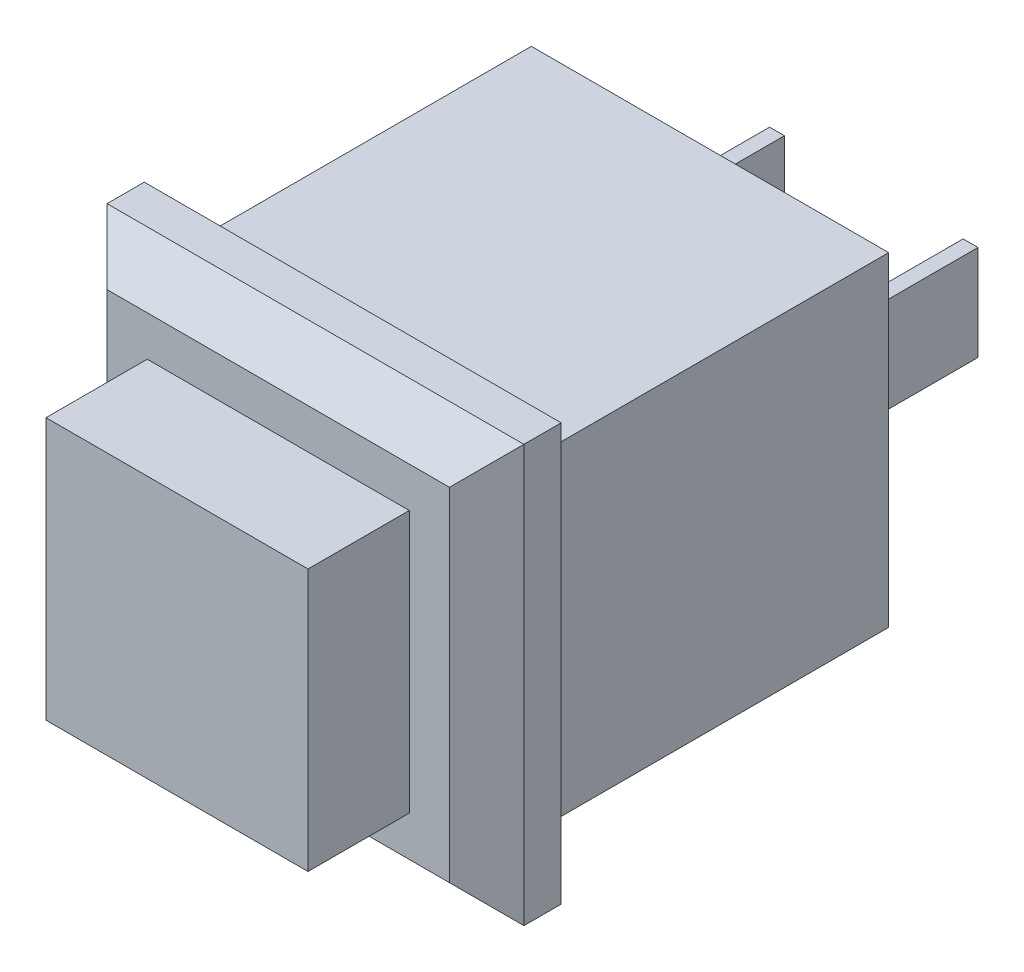
ISO-10303-21;
HEADER;
FILE_DESCRIPTION(('STEP AP214'),'2;1');
FILE_NAME('part.step','',(''),(''),'','','');
FILE_SCHEMA(('AUTOMOTIVE_DESIGN { 1 0 10303 214 1 1 1 1 }'));
ENDSEC;
DATA;
#1=APPLICATION_CONTEXT('core data for automotive mechanical design processes');
#2=APPLICATION_PROTOCOL_DEFINITION('international standard','automotive_design',2000,#1);
#3=PRODUCT_CONTEXT('',#1,'mechanical');
#4=PRODUCT('Part','Part','',(#3));
#5=PRODUCT_RELATED_PRODUCT_CATEGORY('part','',(#4));
#6=PRODUCT_DEFINITION_FORMATION('','',#4);
#7=PRODUCT_DEFINITION_CONTEXT('part definition',#1,'design');
#8=PRODUCT_DEFINITION('design','',#6,#7);
#9=PRODUCT_DEFINITION_SHAPE('','',#8);
#10=(LENGTH_UNIT() NAMED_UNIT(*) SI_UNIT(.MILLI.,.METRE.));
#11=(NAMED_UNIT(*) PLANE_ANGLE_UNIT() SI_UNIT($,.RADIAN.));
#12=(NAMED_UNIT(*) SI_UNIT($,.STERADIAN.) SOLID_ANGLE_UNIT());
#13=UNCERTAINTY_MEASURE_WITH_UNIT(LENGTH_MEASURE(1.E-05),#10,'distance_accuracy_value','');
#14=(GEOMETRIC_REPRESENTATION_CONTEXT(3) GLOBAL_UNCERTAINTY_ASSIGNED_CONTEXT((#13)) GLOBAL_UNIT_ASSIGNED_CONTEXT((#10,
#11,#12)) REPRESENTATION_CONTEXT('',''));
#15=CARTESIAN_POINT('',(0.,0.,0.));
#16=DIRECTION('',(0.,0.,1.));
#17=DIRECTION('',(1.,0.,0.));
#18=AXIS2_PLACEMENT_3D('',#15,#16,#17);
#19=CARTESIAN_POINT('',(-6.,5.45,17.5));
#20=DIRECTION('',(-1.,0.,0.));
#21=DIRECTION('',(0.,-1.,0.));
#22=AXIS2_PLACEMENT_3D('',#19,#20,#21);
#23=PLANE('',#22);
#24=DIRECTION('',(0.,0.,-1.));
#25=VECTOR('',#24,1.);
#26=CARTESIAN_POINT('',(-6.,5.45,17.5));
#27=LINE('',#26,#25);
#28=CARTESIAN_POINT('',(-6.,5.45,17.5));
#29=VERTEX_POINT('',#28);
#30=CARTESIAN_POINT('',(-6.,5.45,5.5));
#31=VERTEX_POINT('',#30);
#32=EDGE_CURVE('E282',#29,#31,#27,.T.);
#33=ORIENTED_EDGE('',*,*,#32,.T.);
#34=DIRECTION('',(0.,1.,0.));
#35=VECTOR('',#34,1.);
#36=CARTESIAN_POINT('',(-6.,5.45,5.5));
#37=LINE('',#36,#35);
#38=CARTESIAN_POINT('',(-6.,-5.45,5.5));
#39=VERTEX_POINT('',#38);
#40=EDGE_CURVE('E266',#39,#31,#37,.T.);
#41=ORIENTED_EDGE('',*,*,#40,.F.);
#42=DIRECTION('',(0.,0.,-1.));
#43=VECTOR('',#42,1.);
#44=CARTESIAN_POINT('',(-6.,-5.45,17.5));
#45=LINE('',#44,#43);
#46=CARTESIAN_POINT('',(-6.,-5.45,17.5));
#47=VERTEX_POINT('',#46);
#48=EDGE_CURVE('E283',#47,#39,#45,.T.);
#49=ORIENTED_EDGE('',*,*,#48,.F.);
#50=DIRECTION('',(0.,1.,0.));
#51=VECTOR('',#50,1.);
#52=CARTESIAN_POINT('',(-6.,5.45,17.5));
#53=LINE('',#52,#51);
#54=EDGE_CURVE('E270',#47,#29,#53,.T.);
#55=ORIENTED_EDGE('',*,*,#54,.T.);
#56=EDGE_LOOP('',(#33,#41,#49,#55));
#57=FACE_BOUND('',#56,.T.);
#58=ADVANCED_FACE('F35',(#57),#23,.T.);
#59=CARTESIAN_POINT('',(6.,-5.45,17.5));
#60=DIRECTION('',(0.,-1.,0.));
#61=DIRECTION('',(0.,0.,-1.));
#62=AXIS2_PLACEMENT_3D('',#59,#60,#61);
#63=PLANE('',#62);
#64=ORIENTED_EDGE('',*,*,#48,.T.);
#65=DIRECTION('',(-1.,0.,0.));
#66=VECTOR('',#65,1.);
#67=CARTESIAN_POINT('',(6.,-5.45,5.5));
#68=LINE('',#67,#66);
#69=CARTESIAN_POINT('',(6.,-5.45,5.5));
#70=VERTEX_POINT('',#69);
#71=EDGE_CURVE('E264',#70,#39,#68,.T.);
#72=ORIENTED_EDGE('',*,*,#71,.F.);
#73=DIRECTION('',(0.,0.,-1.));
#74=VECTOR('',#73,1.);
#75=CARTESIAN_POINT('',(6.,-5.45,17.5));
#76=LINE('',#75,#74);
#77=CARTESIAN_POINT('',(6.,-5.45,17.5));
#78=VERTEX_POINT('',#77);
#79=EDGE_CURVE('E287',#78,#70,#76,.T.);
#80=ORIENTED_EDGE('',*,*,#79,.F.);
#81=DIRECTION('',(-1.,0.,0.));
#82=VECTOR('',#81,1.);
#83=CARTESIAN_POINT('',(6.,-5.45,17.5));
#84=LINE('',#83,#82);
#85=EDGE_CURVE('E279',#78,#47,#84,.T.);
#86=ORIENTED_EDGE('',*,*,#85,.T.);
#87=EDGE_LOOP('',(#64,#72,#80,#86));
#88=FACE_BOUND('',#87,.T.);
#89=ADVANCED_FACE('F427',(#88),#63,.T.);
#90=CARTESIAN_POINT('',(6.,5.45,17.5));
#91=DIRECTION('',(1.,0.,0.));
#92=DIRECTION('',(0.,1.,0.));
#93=AXIS2_PLACEMENT_3D('',#90,#91,#92);
#94=PLANE('',#93);
#95=ORIENTED_EDGE('',*,*,#79,.T.);
#96=DIRECTION('',(0.,-1.,0.));
#97=VECTOR('',#96,1.);
#98=CARTESIAN_POINT('',(6.,5.45,5.5));
#99=LINE('',#98,#97);
#100=CARTESIAN_POINT('',(6.,5.45,5.5));
#101=VERTEX_POINT('',#100);
#102=EDGE_CURVE('E256',#101,#70,#99,.T.);
#103=ORIENTED_EDGE('',*,*,#102,.F.);
#104=DIRECTION('',(0.,0.,-1.));
#105=VECTOR('',#104,1.);
#106=CARTESIAN_POINT('',(6.,5.45,17.5));
#107=LINE('',#106,#105);
#108=CARTESIAN_POINT('',(6.,5.45,17.5));
#109=VERTEX_POINT('',#108);
#110=EDGE_CURVE('E290',#109,#101,#107,.T.);
#111=ORIENTED_EDGE('',*,*,#110,.F.);
#112=DIRECTION('',(0.,-1.,0.));
#113=VECTOR('',#112,1.);
#114=CARTESIAN_POINT('',(6.,5.45,17.5));
#115=LINE('',#114,#113);
#116=EDGE_CURVE('E276',#109,#78,#115,.T.);
#117=ORIENTED_EDGE('',*,*,#116,.T.);
#118=EDGE_LOOP('',(#95,#103,#111,#117));
#119=FACE_BOUND('',#118,.T.);
#120=ADVANCED_FACE('F434',(#119),#94,.T.);
#121=CARTESIAN_POINT('',(6.,5.45,17.5));
#122=DIRECTION('',(0.,1.,0.));
#123=DIRECTION('',(0.,0.,1.));
#124=AXIS2_PLACEMENT_3D('',#121,#122,#123);
#125=PLANE('',#124);
#126=ORIENTED_EDGE('',*,*,#110,.T.);
#127=DIRECTION('',(1.,0.,0.));
#128=VECTOR('',#127,1.);
#129=CARTESIAN_POINT('',(6.,5.45,5.5));
#130=LINE('',#129,#128);
#131=EDGE_CURVE('E268',#31,#101,#130,.T.);
#132=ORIENTED_EDGE('',*,*,#131,.F.);
#133=ORIENTED_EDGE('',*,*,#32,.F.);
#134=DIRECTION('',(1.,0.,0.));
#135=VECTOR('',#134,1.);
#136=CARTESIAN_POINT('',(6.,5.45,17.5));
#137=LINE('',#136,#135);
#138=EDGE_CURVE('E273',#29,#109,#137,.T.);
#139=ORIENTED_EDGE('',*,*,#138,.T.);
#140=EDGE_LOOP('',(#126,#132,#133,#139));
#141=FACE_BOUND('',#140,.T.);
#142=ADVANCED_FACE('F438',(#141),#125,.T.);
#143=CARTESIAN_POINT('',(7.,7.,23.4));
#144=DIRECTION('',(-1.,0.,0.));
#145=DIRECTION('',(0.,-1.,0.));
#146=AXIS2_PLACEMENT_3D('',#143,#144,#145);
#147=PLANE('',#146);
#148=DIRECTION('',(0.,0.,-1.));
#149=VECTOR('',#148,1.);
#150=CARTESIAN_POINT('',(7.,7.,23.4));
#151=LINE('',#150,#149);
#152=CARTESIAN_POINT('',(7.,7.,18.75));
#153=VERTEX_POINT('',#152);
#154=CARTESIAN_POINT('',(7.,7.,17.5));
#155=VERTEX_POINT('',#154);
#156=EDGE_CURVE('E345',#153,#155,#151,.T.);
#157=ORIENTED_EDGE('',*,*,#156,.F.);
#158=DIRECTION('',(0.,-1.,0.));
#159=VECTOR('',#158,1.);
#160=CARTESIAN_POINT('',(7.,-7.,18.75));
#161=LINE('',#160,#159);
#162=CARTESIAN_POINT('',(7.,-7.,18.75));
#163=VERTEX_POINT('',#162);
#164=EDGE_CURVE('E44',#153,#163,#161,.T.);
#165=ORIENTED_EDGE('',*,*,#164,.T.);
#166=DIRECTION('',(0.,0.,-1.));
#167=VECTOR('',#166,1.);
#168=CARTESIAN_POINT('',(7.,-7.,23.4));
#169=LINE('',#168,#167);
#170=CARTESIAN_POINT('',(7.,-7.,17.5));
#171=VERTEX_POINT('',#170);
#172=EDGE_CURVE('E333',#163,#171,#169,.T.);
#173=ORIENTED_EDGE('',*,*,#172,.T.);
#174=DIRECTION('',(0.,-1.,0.));
#175=VECTOR('',#174,1.);
#176=CARTESIAN_POINT('',(7.,7.,17.5));
#177=LINE('',#176,#175);
#178=EDGE_CURVE('E286',#155,#171,#177,.T.);
#179=ORIENTED_EDGE('',*,*,#178,.F.);
#180=EDGE_LOOP('',(#157,#165,#173,#179));
#181=FACE_BOUND('',#180,.T.);
#182=ADVANCED_FACE('F570',(#181),#147,.F.);
#183=CARTESIAN_POINT('',(-7.,7.,23.4));
#184=DIRECTION('',(0.,-1.,0.));
#185=DIRECTION('',(0.,0.,-1.));
#186=AXIS2_PLACEMENT_3D('',#183,#184,#185);
#187=PLANE('',#186);
#188=DIRECTION('',(0.,0.,-1.));
#189=VECTOR('',#188,1.);
#190=CARTESIAN_POINT('',(-7.,7.,23.4));
#191=LINE('',#190,#189);
#192=CARTESIAN_POINT('',(-7.,7.,18.75));
#193=VERTEX_POINT('',#192);
#194=CARTESIAN_POINT('',(-7.,7.,17.5));
#195=VERTEX_POINT('',#194);
#196=EDGE_CURVE('E343',#193,#195,#191,.T.);
#197=ORIENTED_EDGE('',*,*,#196,.F.);
#198=DIRECTION('',(1.,0.,0.));
#199=VECTOR('',#198,1.);
#200=CARTESIAN_POINT('',(7.,7.,18.75));
#201=LINE('',#200,#199);
#202=EDGE_CURVE('E59',#193,#153,#201,.T.);
#203=ORIENTED_EDGE('',*,*,#202,.T.);
#204=ORIENTED_EDGE('',*,*,#156,.T.);
#205=DIRECTION('',(1.,0.,0.));
#206=VECTOR('',#205,1.);
#207=CARTESIAN_POINT('',(7.,7.,17.5));
#208=LINE('',#207,#206);
#209=EDGE_CURVE('E303',#195,#155,#208,.T.);
#210=ORIENTED_EDGE('',*,*,#209,.F.);
#211=EDGE_LOOP('',(#197,#203,#204,#210));
#212=FACE_BOUND('',#211,.T.);
#213=ADVANCED_FACE('F567',(#212),#187,.F.);
#214=CARTESIAN_POINT('',(-7.,7.,23.4));
#215=DIRECTION('',(1.,0.,0.));
#216=DIRECTION('',(0.,1.,0.));
#217=AXIS2_PLACEMENT_3D('',#214,#215,#216);
#218=PLANE('',#217);
#219=DIRECTION('',(0.,0.,-1.));
#220=VECTOR('',#219,1.);
#221=CARTESIAN_POINT('',(-7.,-7.,23.4));
#222=LINE('',#221,#220);
#223=CARTESIAN_POINT('',(-7.,-7.,18.75));
#224=VERTEX_POINT('',#223);
#225=CARTESIAN_POINT('',(-7.,-7.,17.5));
#226=VERTEX_POINT('',#225);
#227=EDGE_CURVE('E341',#224,#226,#222,.T.);
#228=ORIENTED_EDGE('',*,*,#227,.F.);
#229=DIRECTION('',(0.,1.,0.));
#230=VECTOR('',#229,1.);
#231=CARTESIAN_POINT('',(-7.,7.,18.75));
#232=LINE('',#231,#230);
#233=EDGE_CURVE('E356',#224,#193,#232,.T.);
#234=ORIENTED_EDGE('',*,*,#233,.T.);
#235=ORIENTED_EDGE('',*,*,#196,.T.);
#236=DIRECTION('',(0.,1.,0.));
#237=VECTOR('',#236,1.);
#238=CARTESIAN_POINT('',(-7.,7.,17.5));
#239=LINE('',#238,#237);
#240=EDGE_CURVE('E300',#226,#195,#239,.T.);
#241=ORIENTED_EDGE('',*,*,#240,.F.);
#242=EDGE_LOOP('',(#228,#234,#235,#241));
#243=FACE_BOUND('',#242,.T.);
#244=ADVANCED_FACE('F387',(#243),#218,.F.);
#245=CARTESIAN_POINT('',(-7.,-7.,23.4));
#246=DIRECTION('',(0.,1.,0.));
#247=DIRECTION('',(0.,0.,1.));
#248=AXIS2_PLACEMENT_3D('',#245,#246,#247);
#249=PLANE('',#248);
#250=ORIENTED_EDGE('',*,*,#172,.F.);
#251=DIRECTION('',(-1.,0.,0.));
#252=VECTOR('',#251,1.);
#253=CARTESIAN_POINT('',(-7.,-7.,18.75));
#254=LINE('',#253,#252);
#255=EDGE_CURVE('E11',#163,#224,#254,.T.);
#256=ORIENTED_EDGE('',*,*,#255,.T.);
#257=ORIENTED_EDGE('',*,*,#227,.T.);
#258=DIRECTION('',(-1.,0.,0.));
#259=VECTOR('',#258,1.);
#260=CARTESIAN_POINT('',(7.,-7.,17.5));
#261=LINE('',#260,#259);
#262=EDGE_CURVE('E297',#171,#226,#261,.T.);
#263=ORIENTED_EDGE('',*,*,#262,.F.);
#264=EDGE_LOOP('',(#250,#256,#257,#263));
#265=FACE_BOUND('',#264,.T.);
#266=ADVANCED_FACE('F382',(#265),#249,.F.);
#267=CARTESIAN_POINT('',(0.,0.,20.));
#268=DIRECTION('',(0.,0.,1.));
#269=DIRECTION('',(1.,0.,0.));
#270=AXIS2_PLACEMENT_3D('',#267,#268,#269);
#271=PLANE('',#270);
#272=DIRECTION('',(-1.,0.,0.));
#273=VECTOR('',#272,1.);
#274=CARTESIAN_POINT('',(-7.,5.75,20.));
#275=LINE('',#274,#273);
#276=CARTESIAN_POINT('',(5.75,5.75,20.));
#277=VERTEX_POINT('',#276);
#278=CARTESIAN_POINT('',(-5.75,5.75,20.));
#279=VERTEX_POINT('',#278);
#280=EDGE_CURVE('E351',#277,#279,#275,.T.);
#281=ORIENTED_EDGE('',*,*,#280,.T.);
#282=DIRECTION('',(0.,-1.,0.));
#283=VECTOR('',#282,1.);
#284=CARTESIAN_POINT('',(-5.75,-7.,20.));
#285=LINE('',#284,#283);
#286=CARTESIAN_POINT('',(-5.75,-5.75,20.));
#287=VERTEX_POINT('',#286);
#288=EDGE_CURVE('E353',#279,#287,#285,.T.);
#289=ORIENTED_EDGE('',*,*,#288,.T.);
#290=DIRECTION('',(1.,0.,0.));
#291=VECTOR('',#290,1.);
#292=CARTESIAN_POINT('',(7.,-5.75,20.));
#293=LINE('',#292,#291);
#294=CARTESIAN_POINT('',(5.75,-5.75,20.));
#295=VERTEX_POINT('',#294);
#296=EDGE_CURVE('E347',#287,#295,#293,.T.);
#297=ORIENTED_EDGE('',*,*,#296,.T.);
#298=DIRECTION('',(0.,1.,0.));
#299=VECTOR('',#298,1.);
#300=CARTESIAN_POINT('',(5.75,7.,20.));
#301=LINE('',#300,#299);
#302=EDGE_CURVE('E349',#295,#277,#301,.T.);
#303=ORIENTED_EDGE('',*,*,#302,.T.);
#304=EDGE_LOOP('',(#281,#289,#297,#303));
#305=FACE_BOUND('',#304,.T.);
#306=DIRECTION('',(1.,0.,0.));
#307=VECTOR('',#306,1.);
#308=CARTESIAN_POINT('',(-4.4,-4.4,20.));
#309=LINE('',#308,#307);
#310=CARTESIAN_POINT('',(-4.4,-4.4,20.));
#311=VERTEX_POINT('',#310);
#312=CARTESIAN_POINT('',(4.4,-4.4,20.));
#313=VERTEX_POINT('',#312);
#314=EDGE_CURVE('E317',#311,#313,#309,.T.);
#315=ORIENTED_EDGE('',*,*,#314,.F.);
#316=DIRECTION('',(0.,-1.,0.));
#317=VECTOR('',#316,1.);
#318=CARTESIAN_POINT('',(-4.4,4.4,20.));
#319=LINE('',#318,#317);
#320=CARTESIAN_POINT('',(-4.4,4.4,20.));
#321=VERTEX_POINT('',#320);
#322=EDGE_CURVE('E314',#321,#311,#319,.T.);
#323=ORIENTED_EDGE('',*,*,#322,.F.);
#324=DIRECTION('',(-1.,0.,0.));
#325=VECTOR('',#324,1.);
#326=CARTESIAN_POINT('',(-4.4,4.4,20.));
#327=LINE('',#326,#325);
#328=CARTESIAN_POINT('',(4.4,4.4,20.));
#329=VERTEX_POINT('',#328);
#330=EDGE_CURVE('E310',#329,#321,#327,.T.);
#331=ORIENTED_EDGE('',*,*,#330,.F.);
#332=DIRECTION('',(0.,1.,0.));
#333=VECTOR('',#332,1.);
#334=CARTESIAN_POINT('',(4.4,4.4,20.));
#335=LINE('',#334,#333);
#336=EDGE_CURVE('E307',#313,#329,#335,.T.);
#337=ORIENTED_EDGE('',*,*,#336,.F.);
#338=EDGE_LOOP('',(#315,#323,#331,#337));
#339=FACE_BOUND('',#338,.T.);
#340=ADVANCED_FACE('F392',(#305,#339),#271,.T.);
#341=CARTESIAN_POINT('',(4.4,4.4,20.));
#342=DIRECTION('',(1.,0.,0.));
#343=DIRECTION('',(0.,1.,0.));
#344=AXIS2_PLACEMENT_3D('',#341,#342,#343);
#345=PLANE('',#344);
#346=DIRECTION('',(0.,1.,0.));
#347=VECTOR('',#346,1.);
#348=CARTESIAN_POINT('',(4.4,4.4,23.4));
#349=LINE('',#348,#347);
#350=CARTESIAN_POINT('',(4.4,-4.4,23.4));
#351=VERTEX_POINT('',#350);
#352=CARTESIAN_POINT('',(4.4,4.4,23.4));
#353=VERTEX_POINT('',#352);
#354=EDGE_CURVE('E306',#351,#353,#349,.T.);
#355=ORIENTED_EDGE('',*,*,#354,.F.);
#356=DIRECTION('',(0.,0.,1.));
#357=VECTOR('',#356,1.);
#358=CARTESIAN_POINT('',(4.4,-4.4,20.));
#359=LINE('',#358,#357);
#360=EDGE_CURVE('E331',#313,#351,#359,.T.);
#361=ORIENTED_EDGE('',*,*,#360,.F.);
#362=ORIENTED_EDGE('',*,*,#336,.T.);
#363=DIRECTION('',(0.,0.,1.));
#364=VECTOR('',#363,1.);
#365=CARTESIAN_POINT('',(4.4,4.4,20.));
#366=LINE('',#365,#364);
#367=EDGE_CURVE('E320',#329,#353,#366,.T.);
#368=ORIENTED_EDGE('',*,*,#367,.T.);
#369=EDGE_LOOP('',(#355,#361,#362,#368));
#370=FACE_BOUND('',#369,.T.);
#371=ADVANCED_FACE('F395',(#370),#345,.T.);
#372=CARTESIAN_POINT('',(-4.4,-4.4,20.));
#373=DIRECTION('',(0.,-1.,0.));
#374=DIRECTION('',(0.,0.,-1.));
#375=AXIS2_PLACEMENT_3D('',#372,#373,#374);
#376=PLANE('',#375);
#377=DIRECTION('',(1.,0.,0.));
#378=VECTOR('',#377,1.);
#379=CARTESIAN_POINT('',(-4.4,-4.4,23.4));
#380=LINE('',#379,#378);
#381=CARTESIAN_POINT('',(-4.4,-4.4,23.4));
#382=VERTEX_POINT('',#381);
#383=EDGE_CURVE('E311',#382,#351,#380,.T.);
#384=ORIENTED_EDGE('',*,*,#383,.F.);
#385=DIRECTION('',(0.,0.,1.));
#386=VECTOR('',#385,1.);
#387=CARTESIAN_POINT('',(-4.4,-4.4,20.));
#388=LINE('',#387,#386);
#389=EDGE_CURVE('E334',#311,#382,#388,.T.);
#390=ORIENTED_EDGE('',*,*,#389,.F.);
#391=ORIENTED_EDGE('',*,*,#314,.T.);
#392=ORIENTED_EDGE('',*,*,#360,.T.);
#393=EDGE_LOOP('',(#384,#390,#391,#392));
#394=FACE_BOUND('',#393,.T.);
#395=ADVANCED_FACE('F410',(#394),#376,.T.);
#396=CARTESIAN_POINT('',(-4.4,4.4,20.));
#397=DIRECTION('',(-1.,0.,0.));
#398=DIRECTION('',(0.,-1.,0.));
#399=AXIS2_PLACEMENT_3D('',#396,#397,#398);
#400=PLANE('',#399);
#401=DIRECTION('',(0.,-1.,0.));
#402=VECTOR('',#401,1.);
#403=CARTESIAN_POINT('',(-4.4,4.4,23.4));
#404=LINE('',#403,#402);
#405=CARTESIAN_POINT('',(-4.4,4.4,23.4));
#406=VERTEX_POINT('',#405);
#407=EDGE_CURVE('E326',#406,#382,#404,.T.);
#408=ORIENTED_EDGE('',*,*,#407,.F.);
#409=DIRECTION('',(0.,0.,1.));
#410=VECTOR('',#409,1.);
#411=CARTESIAN_POINT('',(-4.4,4.4,20.));
#412=LINE('',#411,#410);
#413=EDGE_CURVE('E336',#321,#406,#412,.T.);
#414=ORIENTED_EDGE('',*,*,#413,.F.);
#415=ORIENTED_EDGE('',*,*,#322,.T.);
#416=ORIENTED_EDGE('',*,*,#389,.T.);
#417=EDGE_LOOP('',(#408,#414,#415,#416));
#418=FACE_BOUND('',#417,.T.);
#419=ADVANCED_FACE('F403',(#418),#400,.T.);
#420=CARTESIAN_POINT('',(-4.4,4.4,20.));
#421=DIRECTION('',(0.,1.,0.));
#422=DIRECTION('',(0.,0.,1.));
#423=AXIS2_PLACEMENT_3D('',#420,#421,#422);
#424=PLANE('',#423);
#425=DIRECTION('',(-1.,0.,0.));
#426=VECTOR('',#425,1.);
#427=CARTESIAN_POINT('',(-4.4,4.4,23.4));
#428=LINE('',#427,#426);
#429=EDGE_CURVE('E323',#353,#406,#428,.T.);
#430=ORIENTED_EDGE('',*,*,#429,.F.);
#431=ORIENTED_EDGE('',*,*,#367,.F.);
#432=ORIENTED_EDGE('',*,*,#330,.T.);
#433=ORIENTED_EDGE('',*,*,#413,.T.);
#434=EDGE_LOOP('',(#430,#431,#432,#433));
#435=FACE_BOUND('',#434,.T.);
#436=ADVANCED_FACE('F407',(#435),#424,.T.);
#437=CARTESIAN_POINT('',(0.,0.,23.4));
#438=DIRECTION('',(0.,0.,1.));
#439=DIRECTION('',(1.,0.,0.));
#440=AXIS2_PLACEMENT_3D('',#437,#438,#439);
#441=PLANE('',#440);
#442=ORIENTED_EDGE('',*,*,#383,.T.);
#443=ORIENTED_EDGE('',*,*,#354,.T.);
#444=ORIENTED_EDGE('',*,*,#429,.T.);
#445=ORIENTED_EDGE('',*,*,#407,.T.);
#446=EDGE_LOOP('',(#442,#443,#444,#445));
#447=FACE_BOUND('',#446,.T.);
#448=ADVANCED_FACE('F412',(#447),#441,.T.);
#449=CARTESIAN_POINT('',(0.,0.,17.5));
#450=DIRECTION('',(0.,0.,-1.));
#451=DIRECTION('',(-1.,0.,0.));
#452=AXIS2_PLACEMENT_3D('',#449,#450,#451);
#453=PLANE('',#452);
#454=ORIENTED_EDGE('',*,*,#85,.F.);
#455=ORIENTED_EDGE('',*,*,#116,.F.);
#456=ORIENTED_EDGE('',*,*,#138,.F.);
#457=ORIENTED_EDGE('',*,*,#54,.F.);
#458=EDGE_LOOP('',(#454,#455,#456,#457));
#459=FACE_BOUND('',#458,.T.);
#460=ORIENTED_EDGE('',*,*,#178,.T.);
#461=ORIENTED_EDGE('',*,*,#262,.T.);
#462=ORIENTED_EDGE('',*,*,#240,.T.);
#463=ORIENTED_EDGE('',*,*,#209,.T.);
#464=EDGE_LOOP('',(#460,#461,#462,#463));
#465=FACE_BOUND('',#464,.T.);
#466=ADVANCED_FACE('F414',(#459,#465),#453,.T.);
#467=CARTESIAN_POINT('',(0.,0.,5.5));
#468=DIRECTION('',(0.,0.,-1.));
#469=DIRECTION('',(-1.,0.,0.));
#470=AXIS2_PLACEMENT_3D('',#467,#468,#469);
#471=PLANE('',#470);
#472=DIRECTION('',(-1.,0.,0.));
#473=VECTOR('',#472,1.);
#474=CARTESIAN_POINT('',(-3.5,-1.6,5.5));
#475=LINE('',#474,#473);
#476=CARTESIAN_POINT('',(-2.99999999999999,-1.6,5.5));
#477=VERTEX_POINT('',#476);
#478=CARTESIAN_POINT('',(-3.5,-1.6,5.5));
#479=VERTEX_POINT('',#478);
#480=EDGE_CURVE('E197',#477,#479,#475,.T.);
#481=ORIENTED_EDGE('',*,*,#480,.F.);
#482=DIRECTION('',(0.,-1.,0.));
#483=VECTOR('',#482,1.);
#484=CARTESIAN_POINT('',(-2.99999999999999,1.6,5.5));
#485=LINE('',#484,#483);
#486=CARTESIAN_POINT('',(-2.99999999999999,1.6,5.5));
#487=VERTEX_POINT('',#486);
#488=EDGE_CURVE('E207',#487,#477,#485,.T.);
#489=ORIENTED_EDGE('',*,*,#488,.F.);
#490=DIRECTION('',(1.,0.,0.));
#491=VECTOR('',#490,1.);
#492=CARTESIAN_POINT('',(-3.5,1.6,5.5));
#493=LINE('',#492,#491);
#494=CARTESIAN_POINT('',(-3.5,1.6,5.5));
#495=VERTEX_POINT('',#494);
#496=EDGE_CURVE('E189',#495,#487,#493,.T.);
#497=ORIENTED_EDGE('',*,*,#496,.F.);
#498=DIRECTION('',(0.,1.,0.));
#499=VECTOR('',#498,1.);
#500=CARTESIAN_POINT('',(-3.5,1.6,5.5));
#501=LINE('',#500,#499);
#502=EDGE_CURVE('E204',#479,#495,#501,.T.);
#503=ORIENTED_EDGE('',*,*,#502,.F.);
#504=EDGE_LOOP('',(#481,#489,#497,#503));
#505=FACE_BOUND('',#504,.T.);
#506=DIRECTION('',(-1.,0.,0.));
#507=VECTOR('',#506,1.);
#508=CARTESIAN_POINT('',(3.5,-1.6,5.5));
#509=LINE('',#508,#507);
#510=CARTESIAN_POINT('',(3.5,-1.6,5.5));
#511=VERTEX_POINT('',#510);
#512=CARTESIAN_POINT('',(3.,-1.6,5.5));
#513=VERTEX_POINT('',#512);
#514=EDGE_CURVE('E240',#511,#513,#509,.T.);
#515=ORIENTED_EDGE('',*,*,#514,.F.);
#516=DIRECTION('',(0.,-1.,0.));
#517=VECTOR('',#516,1.);
#518=CARTESIAN_POINT('',(3.5,1.6,5.5));
#519=LINE('',#518,#517);
#520=CARTESIAN_POINT('',(3.5,1.6,5.5));
#521=VERTEX_POINT('',#520);
#522=EDGE_CURVE('E237',#521,#511,#519,.T.);
#523=ORIENTED_EDGE('',*,*,#522,.F.);
#524=DIRECTION('',(1.,0.,0.));
#525=VECTOR('',#524,1.);
#526=CARTESIAN_POINT('',(3.5,1.6,5.5));
#527=LINE('',#526,#525);
#528=CARTESIAN_POINT('',(3.,1.6,5.5));
#529=VERTEX_POINT('',#528);
#530=EDGE_CURVE('E233',#529,#521,#527,.T.);
#531=ORIENTED_EDGE('',*,*,#530,.F.);
#532=DIRECTION('',(0.,1.,0.));
#533=VECTOR('',#532,1.);
#534=CARTESIAN_POINT('',(3.,1.6,5.5));
#535=LINE('',#534,#533);
#536=EDGE_CURVE('E230',#513,#529,#535,.T.);
#537=ORIENTED_EDGE('',*,*,#536,.F.);
#538=EDGE_LOOP('',(#515,#523,#531,#537));
#539=FACE_BOUND('',#538,.T.);
#540=ORIENTED_EDGE('',*,*,#102,.T.);
#541=ORIENTED_EDGE('',*,*,#71,.T.);
#542=ORIENTED_EDGE('',*,*,#40,.T.);
#543=ORIENTED_EDGE('',*,*,#131,.T.);
#544=EDGE_LOOP('',(#540,#541,#542,#543));
#545=FACE_BOUND('',#544,.T.);
#546=ADVANCED_FACE('F202',(#505,#539,#545),#471,.T.);
#547=CARTESIAN_POINT('',(3.,1.6,5.5));
#548=DIRECTION('',(-1.,0.,0.));
#549=DIRECTION('',(0.,-1.,0.));
#550=AXIS2_PLACEMENT_3D('',#547,#548,#549);
#551=PLANE('',#550);
#552=DIRECTION('',(0.,1.,0.));
#553=VECTOR('',#552,1.);
#554=CARTESIAN_POINT('',(3.,1.6,0.));
#555=LINE('',#554,#553);
#556=CARTESIAN_POINT('',(3.,-1.6,0.));
#557=VERTEX_POINT('',#556);
#558=CARTESIAN_POINT('',(3.,1.6,0.));
#559=VERTEX_POINT('',#558);
#560=EDGE_CURVE('E226',#557,#559,#555,.T.);
#561=ORIENTED_EDGE('',*,*,#560,.F.);
#562=DIRECTION('',(0.,0.,-1.));
#563=VECTOR('',#562,1.);
#564=CARTESIAN_POINT('',(3.,-1.6,5.5));
#565=LINE('',#564,#563);
#566=EDGE_CURVE('E254',#513,#557,#565,.T.);
#567=ORIENTED_EDGE('',*,*,#566,.F.);
#568=ORIENTED_EDGE('',*,*,#536,.T.);
#569=DIRECTION('',(0.,0.,-1.));
#570=VECTOR('',#569,1.);
#571=CARTESIAN_POINT('',(3.,1.6,5.5));
#572=LINE('',#571,#570);
#573=EDGE_CURVE('E243',#529,#559,#572,.T.);
#574=ORIENTED_EDGE('',*,*,#573,.T.);
#575=EDGE_LOOP('',(#561,#567,#568,#574));
#576=FACE_BOUND('',#575,.T.);
#577=ADVANCED_FACE('F472',(#576),#551,.T.);
#578=CARTESIAN_POINT('',(3.5,-1.6,5.5));
#579=DIRECTION('',(0.,-1.,0.));
#580=DIRECTION('',(0.,0.,-1.));
#581=AXIS2_PLACEMENT_3D('',#578,#579,#580);
#582=PLANE('',#581);
#583=DIRECTION('',(-1.,0.,0.));
#584=VECTOR('',#583,1.);
#585=CARTESIAN_POINT('',(3.5,-1.6,0.));
#586=LINE('',#585,#584);
#587=CARTESIAN_POINT('',(3.5,-1.6,0.));
#588=VERTEX_POINT('',#587);
#589=EDGE_CURVE('E234',#588,#557,#586,.T.);
#590=ORIENTED_EDGE('',*,*,#589,.F.);
#591=DIRECTION('',(0.,0.,-1.));
#592=VECTOR('',#591,1.);
#593=CARTESIAN_POINT('',(3.5,-1.6,5.5));
#594=LINE('',#593,#592);
#595=EDGE_CURVE('E257',#511,#588,#594,.T.);
#596=ORIENTED_EDGE('',*,*,#595,.F.);
#597=ORIENTED_EDGE('',*,*,#514,.T.);
#598=ORIENTED_EDGE('',*,*,#566,.T.);
#599=EDGE_LOOP('',(#590,#596,#597,#598));
#600=FACE_BOUND('',#599,.T.);
#601=ADVANCED_FACE('F480',(#600),#582,.T.);
#602=CARTESIAN_POINT('',(3.5,1.6,5.5));
#603=DIRECTION('',(1.,0.,0.));
#604=DIRECTION('',(0.,0.,-1.));
#605=AXIS2_PLACEMENT_3D('',#602,#603,#604);
#606=PLANE('',#605);
#607=DIRECTION('',(0.,-1.,0.));
#608=VECTOR('',#607,1.);
#609=CARTESIAN_POINT('',(3.5,1.6,0.));
#610=LINE('',#609,#608);
#611=CARTESIAN_POINT('',(3.5,1.6,0.));
#612=VERTEX_POINT('',#611);
#613=EDGE_CURVE('E249',#612,#588,#610,.T.);
#614=ORIENTED_EDGE('',*,*,#613,.F.);
#615=DIRECTION('',(0.,0.,-1.));
#616=VECTOR('',#615,1.);
#617=CARTESIAN_POINT('',(3.5,1.6,5.5));
#618=LINE('',#617,#616);
#619=EDGE_CURVE('E259',#521,#612,#618,.T.);
#620=ORIENTED_EDGE('',*,*,#619,.F.);
#621=ORIENTED_EDGE('',*,*,#522,.T.);
#622=ORIENTED_EDGE('',*,*,#595,.T.);
#623=EDGE_LOOP('',(#614,#620,#621,#622));
#624=FACE_BOUND('',#623,.T.);
#625=ADVANCED_FACE('F488',(#624),#606,.T.);
#626=CARTESIAN_POINT('',(3.5,1.6,5.5));
#627=DIRECTION('',(0.,1.,0.));
#628=DIRECTION('',(0.,0.,1.));
#629=AXIS2_PLACEMENT_3D('',#626,#627,#628);
#630=PLANE('',#629);
#631=DIRECTION('',(1.,0.,0.));
#632=VECTOR('',#631,1.);
#633=CARTESIAN_POINT('',(3.5,1.6,0.));
#634=LINE('',#633,#632);
#635=EDGE_CURVE('E246',#559,#612,#634,.T.);
#636=ORIENTED_EDGE('',*,*,#635,.F.);
#637=ORIENTED_EDGE('',*,*,#573,.F.);
#638=ORIENTED_EDGE('',*,*,#530,.T.);
#639=ORIENTED_EDGE('',*,*,#619,.T.);
#640=EDGE_LOOP('',(#636,#637,#638,#639));
#641=FACE_BOUND('',#640,.T.);
#642=ADVANCED_FACE('F496',(#641),#630,.T.);
#643=CARTESIAN_POINT('',(-3.5,1.6,5.5));
#644=DIRECTION('',(-1.,0.,0.));
#645=DIRECTION('',(0.,0.,1.));
#646=AXIS2_PLACEMENT_3D('',#643,#644,#645);
#647=PLANE('',#646);
#648=DIRECTION('',(0.,1.,0.));
#649=VECTOR('',#648,1.);
#650=CARTESIAN_POINT('',(-3.5,1.6,0.));
#651=LINE('',#650,#649);
#652=CARTESIAN_POINT('',(-3.5,-1.6,0.));
#653=VERTEX_POINT('',#652);
#654=CARTESIAN_POINT('',(-3.5,1.6,0.));
#655=VERTEX_POINT('',#654);
#656=EDGE_CURVE('E220',#653,#655,#651,.T.);
#657=ORIENTED_EDGE('',*,*,#656,.F.);
#658=DIRECTION('',(0.,0.,-1.));
#659=VECTOR('',#658,1.);
#660=CARTESIAN_POINT('',(-3.5,-1.6,5.5));
#661=LINE('',#660,#659);
#662=EDGE_CURVE('E211',#479,#653,#661,.T.);
#663=ORIENTED_EDGE('',*,*,#662,.F.);
#664=ORIENTED_EDGE('',*,*,#502,.T.);
#665=DIRECTION('',(0.,0.,-1.));
#666=VECTOR('',#665,1.);
#667=CARTESIAN_POINT('',(-3.5,1.6,5.5));
#668=LINE('',#667,#666);
#669=EDGE_CURVE('E185',#495,#655,#668,.T.);
#670=ORIENTED_EDGE('',*,*,#669,.T.);
#671=EDGE_LOOP('',(#657,#663,#664,#670));
#672=FACE_BOUND('',#671,.T.);
#673=ADVANCED_FACE('F210',(#672),#647,.T.);
#674=CARTESIAN_POINT('',(-3.5,-1.6,5.5));
#675=DIRECTION('',(0.,-1.,0.));
#676=DIRECTION('',(0.,0.,-1.));
#677=AXIS2_PLACEMENT_3D('',#674,#675,#676);
#678=PLANE('',#677);
#679=DIRECTION('',(-1.,0.,0.));
#680=VECTOR('',#679,1.);
#681=CARTESIAN_POINT('',(-3.5,-1.6,0.));
#682=LINE('',#681,#680);
#683=CARTESIAN_POINT('',(-2.99999999999999,-1.6,0.));
#684=VERTEX_POINT('',#683);
#685=EDGE_CURVE('E212',#684,#653,#682,.T.);
#686=ORIENTED_EDGE('',*,*,#685,.F.);
#687=DIRECTION('',(0.,0.,-1.));
#688=VECTOR('',#687,1.);
#689=CARTESIAN_POINT('',(-2.99999999999999,-1.6,5.5));
#690=LINE('',#689,#688);
#691=EDGE_CURVE('E227',#477,#684,#690,.T.);
#692=ORIENTED_EDGE('',*,*,#691,.F.);
#693=ORIENTED_EDGE('',*,*,#480,.T.);
#694=ORIENTED_EDGE('',*,*,#662,.T.);
#695=EDGE_LOOP('',(#686,#692,#693,#694));
#696=FACE_BOUND('',#695,.T.);
#697=ADVANCED_FACE('F511',(#696),#678,.T.);
#698=CARTESIAN_POINT('',(-2.99999999999999,1.6,5.5));
#699=DIRECTION('',(1.,0.,0.));
#700=DIRECTION('',(0.,1.,0.));
#701=AXIS2_PLACEMENT_3D('',#698,#699,#700);
#702=PLANE('',#701);
#703=DIRECTION('',(0.,-1.,0.));
#704=VECTOR('',#703,1.);
#705=CARTESIAN_POINT('',(-2.99999999999999,1.6,0.));
#706=LINE('',#705,#704);
#707=CARTESIAN_POINT('',(-2.99999999999999,1.6,0.));
#708=VERTEX_POINT('',#707);
#709=EDGE_CURVE('E215',#708,#684,#706,.T.);
#710=ORIENTED_EDGE('',*,*,#709,.F.);
#711=DIRECTION('',(0.,0.,-1.));
#712=VECTOR('',#711,1.);
#713=CARTESIAN_POINT('',(-2.99999999999999,1.6,5.5));
#714=LINE('',#713,#712);
#715=EDGE_CURVE('E196',#487,#708,#714,.T.);
#716=ORIENTED_EDGE('',*,*,#715,.F.);
#717=ORIENTED_EDGE('',*,*,#488,.T.);
#718=ORIENTED_EDGE('',*,*,#691,.T.);
#719=EDGE_LOOP('',(#710,#716,#717,#718));
#720=FACE_BOUND('',#719,.T.);
#721=ADVANCED_FACE('F518',(#720),#702,.T.);
#722=CARTESIAN_POINT('',(-3.5,1.6,5.5));
#723=DIRECTION('',(0.,1.,0.));
#724=DIRECTION('',(0.,0.,1.));
#725=AXIS2_PLACEMENT_3D('',#722,#723,#724);
#726=PLANE('',#725);
#727=DIRECTION('',(1.,0.,0.));
#728=VECTOR('',#727,1.);
#729=CARTESIAN_POINT('',(-3.5,1.6,0.));
#730=LINE('',#729,#728);
#731=EDGE_CURVE('E191',#655,#708,#730,.T.);
#732=ORIENTED_EDGE('',*,*,#731,.F.);
#733=ORIENTED_EDGE('',*,*,#669,.F.);
#734=ORIENTED_EDGE('',*,*,#496,.T.);
#735=ORIENTED_EDGE('',*,*,#715,.T.);
#736=EDGE_LOOP('',(#732,#733,#734,#735));
#737=FACE_BOUND('',#736,.T.);
#738=ADVANCED_FACE('F187',(#737),#726,.T.);
#739=CARTESIAN_POINT('',(0.,0.,0.));
#740=DIRECTION('',(0.,0.,1.));
#741=DIRECTION('',(1.,0.,0.));
#742=AXIS2_PLACEMENT_3D('',#739,#740,#741);
#743=PLANE('',#742);
#744=ORIENTED_EDGE('',*,*,#560,.T.);
#745=ORIENTED_EDGE('',*,*,#635,.T.);
#746=ORIENTED_EDGE('',*,*,#613,.T.);
#747=ORIENTED_EDGE('',*,*,#589,.T.);
#748=EDGE_LOOP('',(#744,#745,#746,#747));
#749=FACE_BOUND('',#748,.T.);
#750=ADVANCED_FACE('F533',(#749),#743,.F.);
#751=ORIENTED_EDGE('',*,*,#656,.T.);
#752=ORIENTED_EDGE('',*,*,#731,.T.);
#753=ORIENTED_EDGE('',*,*,#709,.T.);
#754=ORIENTED_EDGE('',*,*,#685,.T.);
#755=EDGE_LOOP('',(#751,#752,#753,#754));
#756=FACE_BOUND('',#755,.T.);
#757=ADVANCED_FACE('F541',(#756),#743,.F.);
#758=CARTESIAN_POINT('',(5.75,0.,20.));
#759=DIRECTION('',(0.707106781186549,0.,0.707106781186545));
#760=DIRECTION('',(0.,-1.,0.));
#761=AXIS2_PLACEMENT_3D('',#758,#759,#760);
#762=PLANE('',#761);
#763=DIRECTION('',(-0.577350269189625,0.577350269189625,0.577350269189628));
#764=VECTOR('',#763,1.);
#765=CARTESIAN_POINT('',(3.83333333333334,-3.83333333333334,21.9166666666667));
#766=LINE('',#765,#764);
#767=EDGE_CURVE('E364',#163,#295,#766,.T.);
#768=ORIENTED_EDGE('',*,*,#767,.F.);
#769=ORIENTED_EDGE('',*,*,#164,.F.);
#770=DIRECTION('',(-0.577350269189625,-0.577350269189625,0.577350269189628));
#771=VECTOR('',#770,1.);
#772=CARTESIAN_POINT('',(3.83333333333334,3.83333333333334,21.9166666666667));
#773=LINE('',#772,#771);
#774=EDGE_CURVE('E39',#277,#153,#773,.F.);
#775=ORIENTED_EDGE('',*,*,#774,.F.);
#776=ORIENTED_EDGE('',*,*,#302,.F.);
#777=EDGE_LOOP('',(#768,#769,#775,#776));
#778=FACE_BOUND('',#777,.T.);
#779=ADVANCED_FACE('F37',(#778),#762,.T.);
#780=CARTESIAN_POINT('',(0.,5.75,20.));
#781=DIRECTION('',(0.,0.707106781186549,0.707106781186545));
#782=DIRECTION('',(1.,0.,0.));
#783=AXIS2_PLACEMENT_3D('',#780,#781,#782);
#784=PLANE('',#783);
#785=ORIENTED_EDGE('',*,*,#774,.T.);
#786=ORIENTED_EDGE('',*,*,#202,.F.);
#787=DIRECTION('',(0.577350269189625,-0.577350269189625,0.577350269189628));
#788=VECTOR('',#787,1.);
#789=CARTESIAN_POINT('',(-3.83333333333334,3.83333333333334,21.9166666666667));
#790=LINE('',#789,#788);
#791=EDGE_CURVE('E363',#279,#193,#790,.F.);
#792=ORIENTED_EDGE('',*,*,#791,.F.);
#793=ORIENTED_EDGE('',*,*,#280,.F.);
#794=EDGE_LOOP('',(#785,#786,#792,#793));
#795=FACE_BOUND('',#794,.T.);
#796=ADVANCED_FACE('F374',(#795),#784,.T.);
#797=CARTESIAN_POINT('',(0.,-5.75,20.));
#798=DIRECTION('',(0.,-0.707106781186549,0.707106781186545));
#799=DIRECTION('',(-1.,0.,0.));
#800=AXIS2_PLACEMENT_3D('',#797,#798,#799);
#801=PLANE('',#800);
#802=ORIENTED_EDGE('',*,*,#767,.T.);
#803=ORIENTED_EDGE('',*,*,#296,.F.);
#804=DIRECTION('',(-0.577350269189625,-0.577350269189625,-0.577350269189628));
#805=VECTOR('',#804,1.);
#806=CARTESIAN_POINT('',(-3.83333333333334,-3.83333333333334,21.9166666666667));
#807=LINE('',#806,#805);
#808=EDGE_CURVE('E361',#224,#287,#807,.F.);
#809=ORIENTED_EDGE('',*,*,#808,.F.);
#810=ORIENTED_EDGE('',*,*,#255,.F.);
#811=EDGE_LOOP('',(#802,#803,#809,#810));
#812=FACE_BOUND('',#811,.T.);
#813=ADVANCED_FACE('F379',(#812),#801,.T.);
#814=CARTESIAN_POINT('',(-5.75,0.,20.));
#815=DIRECTION('',(-0.707106781186549,0.,0.707106781186545));
#816=DIRECTION('',(0.,1.,0.));
#817=AXIS2_PLACEMENT_3D('',#814,#815,#816);
#818=PLANE('',#817);
#819=ORIENTED_EDGE('',*,*,#791,.T.);
#820=ORIENTED_EDGE('',*,*,#233,.F.);
#821=ORIENTED_EDGE('',*,*,#808,.T.);
#822=ORIENTED_EDGE('',*,*,#288,.F.);
#823=EDGE_LOOP('',(#819,#820,#821,#822));
#824=FACE_BOUND('',#823,.T.);
#825=ADVANCED_FACE('F389',(#824),#818,.T.);
#826=CLOSED_SHELL('',(#58,#89,#120,#142,#182,#213,#244,#266,#340,#371,#395,#419,#436,#448,#466,
#546,#577,#601,#625,#642,#673,#697,#721,#738,#750,#757,#779,#796,#813,#825));
#827=MANIFOLD_SOLID_BREP('B2',#826);
#828=ADVANCED_BREP_SHAPE_REPRESENTATION('',(#18,#827),#14);
#829=SHAPE_DEFINITION_REPRESENTATION(#9,#828);
ENDSEC;
END-ISO-10303-21;
